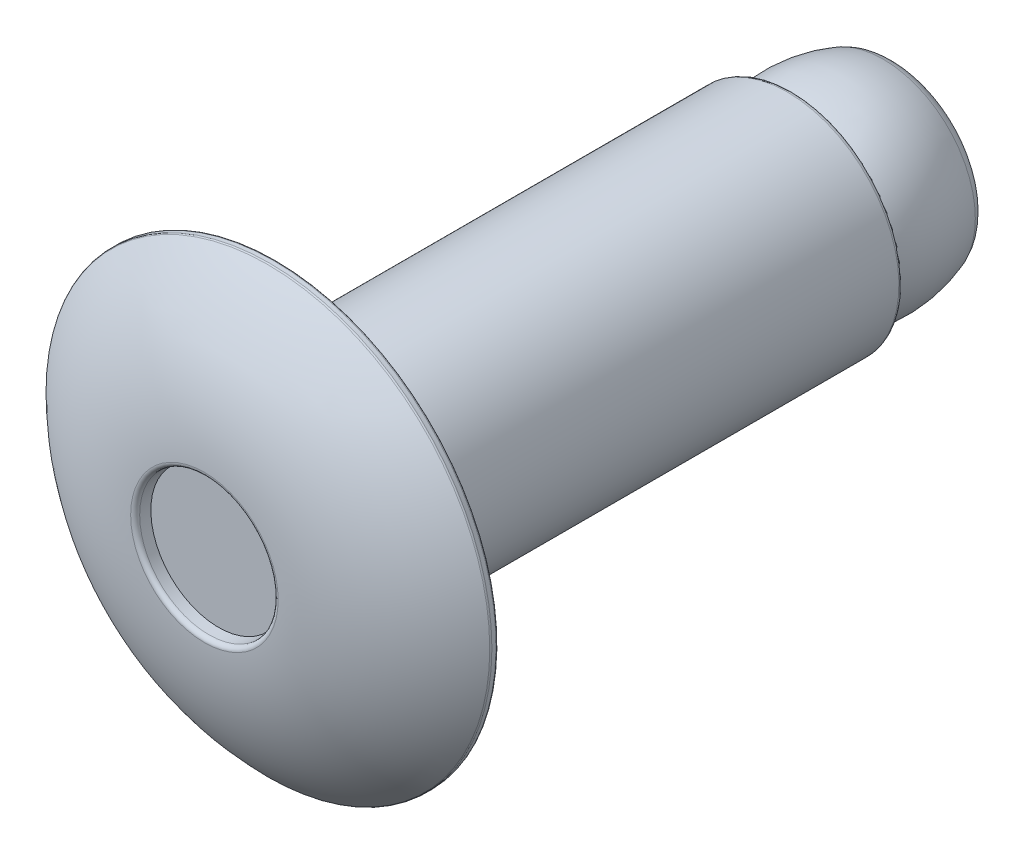
ISO-10303-21;
HEADER;
FILE_DESCRIPTION(('STEP AP214'),'2;1');
FILE_NAME('part.step','',(''),(''),'','','');
FILE_SCHEMA(('AUTOMOTIVE_DESIGN { 1 0 10303 214 1 1 1 1 }'));
ENDSEC;
DATA;
#1=APPLICATION_CONTEXT('core data for automotive mechanical design processes');
#2=APPLICATION_PROTOCOL_DEFINITION('international standard','automotive_design',2000,#1);
#3=PRODUCT_CONTEXT('',#1,'mechanical');
#4=PRODUCT('Part','Part','',(#3));
#5=PRODUCT_RELATED_PRODUCT_CATEGORY('part','',(#4));
#6=PRODUCT_DEFINITION_FORMATION('','',#4);
#7=PRODUCT_DEFINITION_CONTEXT('part definition',#1,'design');
#8=PRODUCT_DEFINITION('design','',#6,#7);
#9=PRODUCT_DEFINITION_SHAPE('','',#8);
#10=(LENGTH_UNIT() NAMED_UNIT(*) SI_UNIT(.MILLI.,.METRE.));
#11=(NAMED_UNIT(*) PLANE_ANGLE_UNIT() SI_UNIT($,.RADIAN.));
#12=(NAMED_UNIT(*) SI_UNIT($,.STERADIAN.) SOLID_ANGLE_UNIT());
#13=UNCERTAINTY_MEASURE_WITH_UNIT(LENGTH_MEASURE(1.E-05),#10,'distance_accuracy_value','');
#14=(GEOMETRIC_REPRESENTATION_CONTEXT(3) GLOBAL_UNCERTAINTY_ASSIGNED_CONTEXT((#13)) GLOBAL_UNIT_ASSIGNED_CONTEXT((#10,
#11,#12)) REPRESENTATION_CONTEXT('',''));
#15=CARTESIAN_POINT('',(0.,0.,0.));
#16=DIRECTION('',(0.,0.,1.));
#17=DIRECTION('',(1.,0.,0.));
#18=AXIS2_PLACEMENT_3D('',#15,#16,#17);
#19=CARTESIAN_POINT('',(0.,0.,-6.63019375000002));
#20=DIRECTION('',(0.,0.,1.));
#21=DIRECTION('',(1.,0.,0.));
#22=AXIS2_PLACEMENT_3D('',#19,#20,#21);
#23=PLANE('',#22);
#24=CARTESIAN_POINT('',(0.,0.,-6.63019375000002));
#25=DIRECTION('',(0.,0.,-1.));
#26=DIRECTION('',(1.,0.,0.));
#27=AXIS2_PLACEMENT_3D('',#24,#25,#26);
#28=CIRCLE('',#27,1.2065);
#29=CARTESIAN_POINT('',(1.2065,0.,-6.63019375000002));
#30=VERTEX_POINT('',#29);
#31=EDGE_CURVE('E117',#30,#30,#28,.T.);
#32=ORIENTED_EDGE('',*,*,#31,.F.);
#33=EDGE_LOOP('',(#32));
#34=FACE_BOUND('',#33,.T.);
#35=ADVANCED_FACE('F17',(#34),#23,.T.);
#36=CARTESIAN_POINT('',(0.,0.,-7.51919375));
#37=DIRECTION('',(0.,0.,-1.));
#38=DIRECTION('',(0.,1.,0.));
#39=AXIS2_PLACEMENT_3D('',#36,#37,#38);
#40=CONICAL_SURFACE('',#39,2.8448,0.78539816339746);
#41=CARTESIAN_POINT('',(0.,0.,-7.51919375));
#42=DIRECTION('',(0.,0.,-1.));
#43=DIRECTION('',(0.,1.,0.));
#44=AXIS2_PLACEMENT_3D('',#41,#42,#43);
#45=CIRCLE('',#44,2.8448);
#46=CARTESIAN_POINT('',(0.,2.8448,-7.51919375));
#47=VERTEX_POINT('',#46);
#48=EDGE_CURVE('E150',#47,#47,#45,.T.);
#49=ORIENTED_EDGE('',*,*,#48,.F.);
#50=EDGE_LOOP('',(#49));
#51=FACE_BOUND('',#50,.T.);
#52=CARTESIAN_POINT('',(0.,0.,-7.64619375));
#53=DIRECTION('',(0.,0.,-1.));
#54=DIRECTION('',(0.,1.,0.));
#55=AXIS2_PLACEMENT_3D('',#52,#53,#54);
#56=CIRCLE('',#55,2.9718);
#57=CARTESIAN_POINT('',(0.,2.9718,-7.64619375));
#58=VERTEX_POINT('',#57);
#59=EDGE_CURVE('E153',#58,#58,#56,.T.);
#60=ORIENTED_EDGE('',*,*,#59,.T.);
#61=EDGE_LOOP('',(#60));
#62=FACE_BOUND('',#61,.T.);
#63=ADVANCED_FACE('F444',(#51,#62),#40,.F.);
#64=CARTESIAN_POINT('',(0.,0.,-7.60809375));
#65=DIRECTION('',(0.,0.,-1.));
#66=DIRECTION('',(0.,1.,0.));
#67=AXIS2_PLACEMENT_3D('',#64,#65,#66);
#68=TOROIDAL_SURFACE('',#67,3.9243,0.0381);
#69=CARTESIAN_POINT('',(0.,0.,-7.60809375));
#70=DIRECTION('',(0.,0.,1.));
#71=DIRECTION('',(0.,1.,0.));
#72=AXIS2_PLACEMENT_3D('',#69,#70,#71);
#73=CIRCLE('',#72,3.9624);
#74=CARTESIAN_POINT('',(0.,3.9624,-7.60809375));
#75=VERTEX_POINT('',#74);
#76=EDGE_CURVE('E156',#75,#75,#73,.T.);
#77=ORIENTED_EDGE('',*,*,#76,.F.);
#78=EDGE_LOOP('',(#77));
#79=FACE_BOUND('',#78,.T.);
#80=CARTESIAN_POINT('',(0.,0.,-7.64619375));
#81=DIRECTION('',(0.,0.,-1.));
#82=DIRECTION('',(0.,1.,0.));
#83=AXIS2_PLACEMENT_3D('',#80,#81,#82);
#84=CIRCLE('',#83,3.9243);
#85=CARTESIAN_POINT('',(0.,3.9243,-7.64619375));
#86=VERTEX_POINT('',#85);
#87=EDGE_CURVE('E161',#86,#86,#84,.T.);
#88=ORIENTED_EDGE('',*,*,#87,.F.);
#89=EDGE_LOOP('',(#88));
#90=FACE_BOUND('',#89,.T.);
#91=ADVANCED_FACE('F435',(#79,#90),#68,.T.);
#92=CARTESIAN_POINT('',(0.,0.,-7.53500040038712));
#93=DIRECTION('',(0.,0.,1.));
#94=DIRECTION('',(0.,-1.,0.));
#95=AXIS2_PLACEMENT_3D('',#92,#93,#94);
#96=TOROIDAL_SURFACE('',#95,3.9243,0.0381);
#97=CARTESIAN_POINT('',(0.,0.,-7.50797437413246));
#98=DIRECTION('',(0.,0.,1.));
#99=DIRECTION('',(0.,1.,0.));
#100=AXIS2_PLACEMENT_3D('',#97,#98,#99);
#101=CIRCLE('',#100,3.95115523980311);
#102=CARTESIAN_POINT('',(0.,3.95115523980311,-7.50797437413246));
#103=VERTEX_POINT('',#102);
#104=EDGE_CURVE('E149',#103,#103,#101,.T.);
#105=ORIENTED_EDGE('',*,*,#104,.F.);
#106=EDGE_LOOP('',(#105));
#107=FACE_BOUND('',#106,.T.);
#108=CARTESIAN_POINT('',(0.,0.,-7.53500040038712));
#109=DIRECTION('',(0.,0.,-1.));
#110=DIRECTION('',(0.,-1.,0.));
#111=AXIS2_PLACEMENT_3D('',#108,#109,#110);
#112=CIRCLE('',#111,3.9624);
#113=CARTESIAN_POINT('',(0.,-3.9624,-7.53500040038712));
#114=VERTEX_POINT('',#113);
#115=EDGE_CURVE('E131',#114,#114,#112,.T.);
#116=ORIENTED_EDGE('',*,*,#115,.F.);
#117=EDGE_LOOP('',(#116));
#118=FACE_BOUND('',#117,.T.);
#119=ADVANCED_FACE('F426',(#107,#118),#96,.T.);
#120=CARTESIAN_POINT('',(0.,0.,-18.3475590830986));
#121=DIRECTION('',(0.,0.,1.));
#122=DIRECTION('',(0.,-1.,0.));
#123=AXIS2_PLACEMENT_3D('',#120,#121,#122);
#124=TOROIDAL_SURFACE('',#123,1.30213450873276,0.3571875);
#125=CARTESIAN_POINT('',(0.,0.,-18.4682891102575));
#126=DIRECTION('',(0.,0.,1.));
#127=DIRECTION('',(0.,-1.,0.));
#128=AXIS2_PLACEMENT_3D('',#125,#126,#127);
#129=CIRCLE('',#128,1.63829990061371);
#130=CARTESIAN_POINT('',(0.,-1.6382999006137,-18.4682891102575));
#131=VERTEX_POINT('',#130);
#132=EDGE_CURVE('E132',#131,#131,#129,.T.);
#133=ORIENTED_EDGE('',*,*,#132,.F.);
#134=EDGE_LOOP('',(#133));
#135=FACE_BOUND('',#134,.T.);
#136=CARTESIAN_POINT('',(0.,0.,-18.6642855844967));
#137=DIRECTION('',(0.,0.,-1.));
#138=DIRECTION('',(0.,-1.,0.));
#139=AXIS2_PLACEMENT_3D('',#136,#137,#138);
#140=CIRCLE('',#139,1.46726243934532);
#141=CARTESIAN_POINT('',(0.,-1.46726243934532,-18.6642855844967));
#142=VERTEX_POINT('',#141);
#143=EDGE_CURVE('E137',#142,#142,#140,.T.);
#144=ORIENTED_EDGE('',*,*,#143,.F.);
#145=EDGE_LOOP('',(#144));
#146=FACE_BOUND('',#145,.T.);
#147=ADVANCED_FACE('F339',(#135,#146),#124,.T.);
#148=CARTESIAN_POINT('',(0.,0.,-16.76161875));
#149=DIRECTION('',(0.,0.,-1.));
#150=DIRECTION('',(0.,1.,0.));
#151=AXIS2_PLACEMENT_3D('',#148,#149,#150);
#152=TOROIDAL_SURFACE('',#151,1.905,0.079375);
#153=CARTESIAN_POINT('',(0.,0.,-16.76161875));
#154=DIRECTION('',(0.,0.,1.));
#155=DIRECTION('',(0.,1.,0.));
#156=AXIS2_PLACEMENT_3D('',#153,#154,#155);
#157=CIRCLE('',#156,1.984375);
#158=CARTESIAN_POINT('',(0.,1.984375,-16.76161875));
#159=VERTEX_POINT('',#158);
#160=EDGE_CURVE('E25',#159,#159,#157,.T.);
#161=ORIENTED_EDGE('',*,*,#160,.F.);
#162=EDGE_LOOP('',(#161));
#163=FACE_BOUND('',#162,.T.);
#164=CARTESIAN_POINT('',(0.,0.,-16.84099375));
#165=DIRECTION('',(0.,0.,-1.));
#166=DIRECTION('',(0.,1.,0.));
#167=AXIS2_PLACEMENT_3D('',#164,#165,#166);
#168=CIRCLE('',#167,1.905);
#169=CARTESIAN_POINT('',(0.,1.905,-16.84099375));
#170=VERTEX_POINT('',#169);
#171=EDGE_CURVE('E170',#170,#170,#168,.T.);
#172=ORIENTED_EDGE('',*,*,#171,.F.);
#173=EDGE_LOOP('',(#172));
#174=FACE_BOUND('',#173,.T.);
#175=ADVANCED_FACE('F334',(#163,#174),#152,.T.);
#176=CARTESIAN_POINT('',(0.,0.,-16.76161875));
#177=DIRECTION('',(0.,0.,-1.));
#178=DIRECTION('',(0.,1.,0.));
#179=AXIS2_PLACEMENT_3D('',#176,#177,#178);
#180=TOROIDAL_SURFACE('',#179,1.81881570151336,0.079375);
#181=CARTESIAN_POINT('',(0.,0.,-16.84099375));
#182=DIRECTION('',(0.,0.,1.));
#183=DIRECTION('',(0.,1.,0.));
#184=AXIS2_PLACEMENT_3D('',#181,#182,#183);
#185=CIRCLE('',#184,1.81881570151336);
#186=CARTESIAN_POINT('',(0.,1.81881570151336,-16.84099375));
#187=VERTEX_POINT('',#186);
#188=EDGE_CURVE('E173',#187,#187,#185,.T.);
#189=ORIENTED_EDGE('',*,*,#188,.F.);
#190=EDGE_LOOP('',(#189));
#191=FACE_BOUND('',#190,.T.);
#192=CARTESIAN_POINT('',(0.,0.,-16.8177453507567));
#193=DIRECTION('',(0.,0.,-1.));
#194=DIRECTION('',(0.,-1.,0.));
#195=AXIS2_PLACEMENT_3D('',#192,#193,#194);
#196=CIRCLE('',#195,1.76268910075668);
#197=CARTESIAN_POINT('',(0.,-1.76268910075668,-16.8177453507567));
#198=VERTEX_POINT('',#197);
#199=EDGE_CURVE('E134',#198,#198,#196,.T.);
#200=ORIENTED_EDGE('',*,*,#199,.F.);
#201=EDGE_LOOP('',(#200));
#202=FACE_BOUND('',#201,.T.);
#203=ADVANCED_FACE('F338',(#191,#202),#180,.T.);
#204=CARTESIAN_POINT('',(0.,0.,-6.45700797233715));
#205=DIRECTION('',(0.,0.,1.));
#206=DIRECTION('',(0.,-1.,0.));
#207=AXIS2_PLACEMENT_3D('',#204,#205,#206);
#208=TOROIDAL_SURFACE('',#207,1.311275,0.079375);
#209=CARTESIAN_POINT('',(0.,0.,-6.45700797233715));
#210=DIRECTION('',(0.,0.,1.));
#211=DIRECTION('',(0.,-1.,0.));
#212=AXIS2_PLACEMENT_3D('',#209,#210,#211);
#213=CIRCLE('',#212,1.2319);
#214=CARTESIAN_POINT('',(0.,-1.2319,-6.45700797233715));
#215=VERTEX_POINT('',#214);
#216=EDGE_CURVE('E143',#215,#215,#213,.T.);
#217=ORIENTED_EDGE('',*,*,#216,.F.);
#218=EDGE_LOOP('',(#217));
#219=FACE_BOUND('',#218,.T.);
#220=CARTESIAN_POINT('',(0.,0.,-6.3776629206416));
#221=DIRECTION('',(0.,0.,-1.));
#222=DIRECTION('',(0.,1.,0.));
#223=AXIS2_PLACEMENT_3D('',#220,#221,#222);
#224=CIRCLE('',#223,1.31345522852545);
#225=CARTESIAN_POINT('',(0.,1.31345522852545,-6.3776629206416));
#226=VERTEX_POINT('',#225);
#227=EDGE_CURVE('E146',#226,#226,#224,.T.);
#228=ORIENTED_EDGE('',*,*,#227,.F.);
#229=EDGE_LOOP('',(#228));
#230=FACE_BOUND('',#229,.T.);
#231=ADVANCED_FACE('F401',(#219,#230),#208,.T.);
#232=CARTESIAN_POINT('',(0.,0.,-7.59856875));
#233=DIRECTION('',(0.,0.,-1.));
#234=DIRECTION('',(0.,1.,0.));
#235=AXIS2_PLACEMENT_3D('',#232,#233,#234);
#236=TOROIDAL_SURFACE('',#235,2.06375,0.079375);
#237=CARTESIAN_POINT('',(0.,0.,-7.51919375));
#238=DIRECTION('',(0.,0.,1.));
#239=DIRECTION('',(0.,1.,0.));
#240=AXIS2_PLACEMENT_3D('',#237,#238,#239);
#241=CIRCLE('',#240,2.06375);
#242=CARTESIAN_POINT('',(0.,2.06375,-7.51919375));
#243=VERTEX_POINT('',#242);
#244=EDGE_CURVE('E140',#243,#243,#241,.T.);
#245=ORIENTED_EDGE('',*,*,#244,.F.);
#246=EDGE_LOOP('',(#245));
#247=FACE_BOUND('',#246,.T.);
#248=CARTESIAN_POINT('',(0.,0.,-7.59856875));
#249=DIRECTION('',(0.,0.,-1.));
#250=DIRECTION('',(0.,1.,0.));
#251=AXIS2_PLACEMENT_3D('',#248,#249,#250);
#252=CIRCLE('',#251,1.984375);
#253=CARTESIAN_POINT('',(0.,1.984375,-7.59856875));
#254=VERTEX_POINT('',#253);
#255=EDGE_CURVE('E11',#254,#254,#252,.T.);
#256=ORIENTED_EDGE('',*,*,#255,.F.);
#257=EDGE_LOOP('',(#256));
#258=FACE_BOUND('',#257,.T.);
#259=ADVANCED_FACE('F385',(#247,#258),#236,.F.);
#260=CARTESIAN_POINT('',(0.,0.,-19.02380625));
#261=DIRECTION('',(0.,0.,-1.));
#262=DIRECTION('',(0.,1.,0.));
#263=AXIS2_PLACEMENT_3D('',#260,#261,#262);
#264=CYLINDRICAL_SURFACE('',#263,1.984375);
#265=ORIENTED_EDGE('',*,*,#255,.T.);
#266=EDGE_LOOP('',(#265));
#267=FACE_BOUND('',#266,.T.);
#268=ORIENTED_EDGE('',*,*,#160,.T.);
#269=EDGE_LOOP('',(#268));
#270=FACE_BOUND('',#269,.T.);
#271=ADVANCED_FACE('F381',(#267,#270),#264,.T.);
#272=CARTESIAN_POINT('',(0.,1.984375,-16.84099375));
#273=DIRECTION('',(0.,0.,-1.));
#274=DIRECTION('',(-1.,0.,0.));
#275=AXIS2_PLACEMENT_3D('',#272,#273,#274);
#276=PLANE('',#275);
#277=ORIENTED_EDGE('',*,*,#188,.T.);
#278=EDGE_LOOP('',(#277));
#279=FACE_BOUND('',#278,.T.);
#280=ORIENTED_EDGE('',*,*,#171,.T.);
#281=EDGE_LOOP('',(#280));
#282=FACE_BOUND('',#281,.T.);
#283=ADVANCED_FACE('F375',(#279,#282),#276,.T.);
#284=CARTESIAN_POINT('',(0.,0.,-16.64255625));
#285=DIRECTION('',(0.,0.,-1.));
#286=DIRECTION('',(0.,1.,0.));
#287=AXIS2_PLACEMENT_3D('',#284,#285,#286);
#288=CONICAL_SURFACE('',#287,1.5875,0.785398163397443);
#289=CARTESIAN_POINT('',(0.,0.,-16.64255625));
#290=DIRECTION('',(0.,0.,-1.));
#291=DIRECTION('',(0.,1.,0.));
#292=AXIS2_PLACEMENT_3D('',#289,#290,#291);
#293=CIRCLE('',#292,1.5875);
#294=CARTESIAN_POINT('',(0.,1.5875,-16.64255625));
#295=VERTEX_POINT('',#294);
#296=EDGE_CURVE('E135',#295,#295,#293,.T.);
#297=ORIENTED_EDGE('',*,*,#296,.F.);
#298=EDGE_LOOP('',(#297));
#299=FACE_BOUND('',#298,.T.);
#300=ORIENTED_EDGE('',*,*,#199,.T.);
#301=EDGE_LOOP('',(#300));
#302=FACE_BOUND('',#301,.T.);
#303=ADVANCED_FACE('F366',(#299,#302),#288,.F.);
#304=CARTESIAN_POINT('',(0.,0.,-17.6204059539807));
#305=DIRECTION('',(0.,0.,-1.));
#306=DIRECTION('',(0.,-1.,0.));
#307=AXIS2_PLACEMENT_3D('',#304,#305,#306);
#308=DEGENERATE_TOROIDAL_SURFACE('',#307,0.722578997590855,2.50851649759085,.F.);
#309=ORIENTED_EDGE('',*,*,#132,.T.);
#310=EDGE_LOOP('',(#309));
#311=FACE_BOUND('',#310,.T.);
#312=ORIENTED_EDGE('',*,*,#296,.T.);
#313=EDGE_LOOP('',(#312));
#314=FACE_BOUND('',#313,.T.);
#315=ADVANCED_FACE('F357',(#311,#314),#308,.F.);
#316=CARTESIAN_POINT('',(0.,0.,-15.8499773246965));
#317=DIRECTION('',(1.,0.,0.));
#318=DIRECTION('',(0.,1.,0.));
#319=AXIS2_PLACEMENT_3D('',#316,#317,#318);
#320=SPHERICAL_SURFACE('',#319,3.1738289253035);
#321=CARTESIAN_POINT('',(0.,0.,-15.8499773246965));
#322=DIRECTION('',(0.,0.,-1.));
#323=DIRECTION('',(0.,-1.,0.));
#324=AXIS2_PLACEMENT_3D('',#321,#322,#323);
#325=SPHERICAL_SURFACE('',#324,3.1738289253035);
#326=ORIENTED_EDGE('',*,*,#143,.T.);
#327=EDGE_LOOP('',(#326));
#328=FACE_BOUND('',#327,.T.);
#329=ADVANCED_FACE('F348',(#328),#325,.T.);
#330=CARTESIAN_POINT('',(0.,0.,-7.51919375));
#331=DIRECTION('',(0.,0.,-1.));
#332=DIRECTION('',(-1.,0.,0.));
#333=AXIS2_PLACEMENT_3D('',#330,#331,#332);
#334=PLANE('',#333);
#335=ORIENTED_EDGE('',*,*,#244,.T.);
#336=EDGE_LOOP('',(#335));
#337=FACE_BOUND('',#336,.T.);
#338=ORIENTED_EDGE('',*,*,#48,.T.);
#339=EDGE_LOOP('',(#338));
#340=FACE_BOUND('',#339,.T.);
#341=ADVANCED_FACE('F303',(#337,#340),#334,.T.);
#342=CARTESIAN_POINT('',(0.,3.9624,-7.64619375));
#343=DIRECTION('',(0.,0.,-1.));
#344=DIRECTION('',(-1.,0.,0.));
#345=AXIS2_PLACEMENT_3D('',#342,#343,#344);
#346=PLANE('',#345);
#347=ORIENTED_EDGE('',*,*,#59,.F.);
#348=EDGE_LOOP('',(#347));
#349=FACE_BOUND('',#348,.T.);
#350=ORIENTED_EDGE('',*,*,#87,.T.);
#351=EDGE_LOOP('',(#350));
#352=FACE_BOUND('',#351,.T.);
#353=ADVANCED_FACE('F298',(#349,#352),#346,.T.);
#354=CARTESIAN_POINT('',(0.,0.,-19.02380625));
#355=DIRECTION('',(0.,0.,-1.));
#356=DIRECTION('',(0.,1.,0.));
#357=AXIS2_PLACEMENT_3D('',#354,#355,#356);
#358=CYLINDRICAL_SURFACE('',#357,3.9624);
#359=ORIENTED_EDGE('',*,*,#115,.T.);
#360=EDGE_LOOP('',(#359));
#361=FACE_BOUND('',#360,.T.);
#362=ORIENTED_EDGE('',*,*,#76,.T.);
#363=EDGE_LOOP('',(#362));
#364=FACE_BOUND('',#363,.T.);
#365=ADVANCED_FACE('F302',(#361,#364),#358,.T.);
#366=CARTESIAN_POINT('',(0.,0.,-10.2700843055556));
#367=DIRECTION('',(0.,0.,-1.));
#368=DIRECTION('',(0.,1.,0.));
#369=AXIS2_PLACEMENT_3D('',#366,#367,#368);
#370=DEGENERATE_TOROIDAL_SURFACE('',#369,1.2065,3.89389055555556,.T.);
#371=ORIENTED_EDGE('',*,*,#104,.T.);
#372=EDGE_LOOP('',(#371));
#373=FACE_BOUND('',#372,.T.);
#374=ORIENTED_EDGE('',*,*,#227,.T.);
#375=EDGE_LOOP('',(#374));
#376=FACE_BOUND('',#375,.T.);
#377=ADVANCED_FACE('F312',(#373,#376),#370,.T.);
#378=CARTESIAN_POINT('',(0.,0.,-19.02380625));
#379=DIRECTION('',(0.,0.,-1.));
#380=DIRECTION('',(0.,1.,0.));
#381=AXIS2_PLACEMENT_3D('',#378,#379,#380);
#382=CYLINDRICAL_SURFACE('',#381,1.2319);
#383=ORIENTED_EDGE('',*,*,#216,.T.);
#384=EDGE_LOOP('',(#383));
#385=FACE_BOUND('',#384,.T.);
#386=CARTESIAN_POINT('',(0.,0.,-7.51919375));
#387=DIRECTION('',(0.,0.,-1.));
#388=DIRECTION('',(0.,1.,0.));
#389=AXIS2_PLACEMENT_3D('',#386,#387,#388);
#390=CIRCLE('',#389,1.2319);
#391=CARTESIAN_POINT('',(0.,1.2319,-7.51919375));
#392=VERTEX_POINT('',#391);
#393=EDGE_CURVE('E127',#392,#392,#390,.T.);
#394=ORIENTED_EDGE('',*,*,#393,.T.);
#395=EDGE_LOOP('',(#394));
#396=FACE_BOUND('',#395,.T.);
#397=ADVANCED_FACE('F292',(#385,#396),#382,.F.);
#398=CARTESIAN_POINT('',(0.,1.2065,-7.51919375));
#399=DIRECTION('',(0.,0.,1.));
#400=DIRECTION('',(0.,-1.,0.));
#401=AXIS2_PLACEMENT_3D('',#398,#399,#400);
#402=PLANE('',#401);
#403=CARTESIAN_POINT('',(0.,0.,-7.51919375));
#404=DIRECTION('',(0.,0.,-1.));
#405=DIRECTION('',(0.,1.,0.));
#406=AXIS2_PLACEMENT_3D('',#403,#404,#405);
#407=CIRCLE('',#406,1.2065);
#408=CARTESIAN_POINT('',(0.,1.2065,-7.51919375));
#409=VERTEX_POINT('',#408);
#410=EDGE_CURVE('E121',#409,#409,#407,.T.);
#411=ORIENTED_EDGE('',*,*,#410,.T.);
#412=EDGE_LOOP('',(#411));
#413=FACE_BOUND('',#412,.T.);
#414=ORIENTED_EDGE('',*,*,#393,.F.);
#415=EDGE_LOOP('',(#414));
#416=FACE_BOUND('',#415,.T.);
#417=ADVANCED_FACE('F284',(#413,#416),#402,.T.);
#418=CARTESIAN_POINT('',(0.,0.,-19.02380625));
#419=DIRECTION('',(0.,0.,-1.));
#420=DIRECTION('',(0.,1.,0.));
#421=AXIS2_PLACEMENT_3D('',#418,#419,#420);
#422=CYLINDRICAL_SURFACE('',#421,1.2065);
#423=ORIENTED_EDGE('',*,*,#410,.F.);
#424=EDGE_LOOP('',(#423));
#425=FACE_BOUND('',#424,.T.);
#426=ORIENTED_EDGE('',*,*,#31,.T.);
#427=EDGE_LOOP('',(#426));
#428=FACE_BOUND('',#427,.T.);
#429=ADVANCED_FACE('F118',(#425,#428),#422,.T.);
#430=CLOSED_SHELL('',(#35,#63,#91,#119,#147,#175,#203,#231,#259,#271,#283,#303,#315,#329,#341,
#353,#365,#377,#397,#417,#429));
#431=MANIFOLD_SOLID_BREP('B1',#430);
#432=ADVANCED_BREP_SHAPE_REPRESENTATION('',(#18,#431),#14);
#433=SHAPE_DEFINITION_REPRESENTATION(#9,#432);
ENDSEC;
END-ISO-10303-21;
